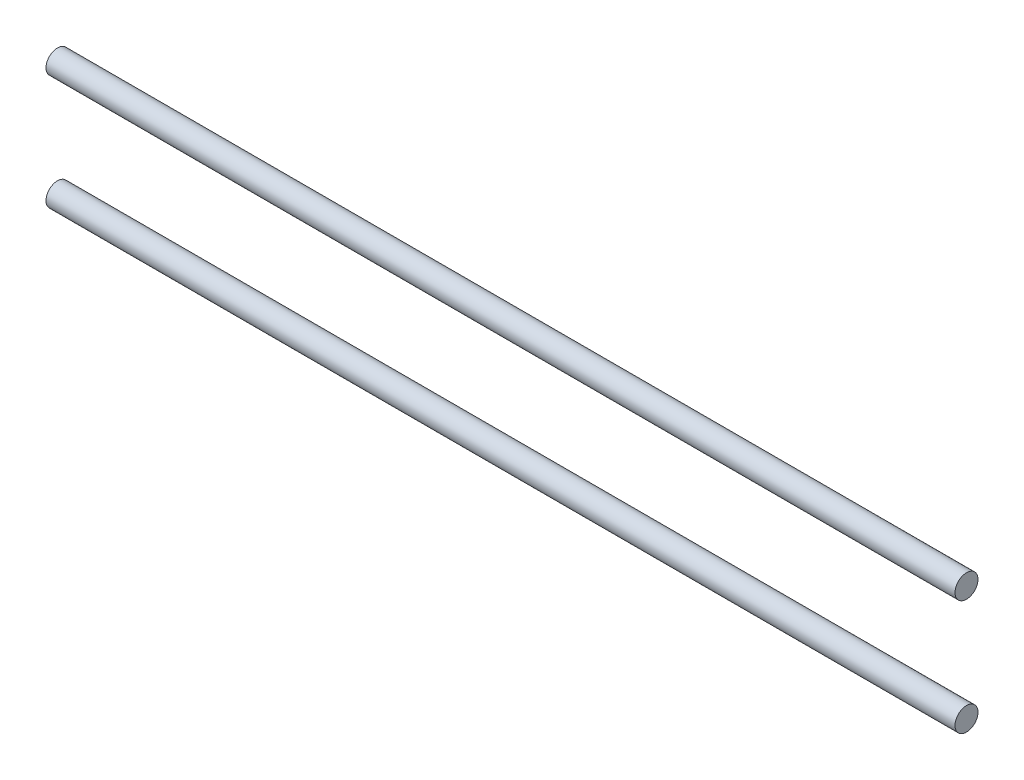
ISO-10303-21;
HEADER;
FILE_DESCRIPTION(('STEP AP214'),'2;1');
FILE_NAME('part.step','',(''),(''),'','','');
FILE_SCHEMA(('AUTOMOTIVE_DESIGN { 1 0 10303 214 1 1 1 1 }'));
ENDSEC;
DATA;
#1=APPLICATION_CONTEXT('core data for automotive mechanical design processes');
#2=APPLICATION_PROTOCOL_DEFINITION('international standard','automotive_design',2000,#1);
#3=PRODUCT_CONTEXT('',#1,'mechanical');
#4=PRODUCT('Part','Part','',(#3));
#5=PRODUCT_RELATED_PRODUCT_CATEGORY('part','',(#4));
#6=PRODUCT_DEFINITION_FORMATION('','',#4);
#7=PRODUCT_DEFINITION_CONTEXT('part definition',#1,'design');
#8=PRODUCT_DEFINITION('design','',#6,#7);
#9=PRODUCT_DEFINITION_SHAPE('','',#8);
#10=(LENGTH_UNIT() NAMED_UNIT(*) SI_UNIT(.MILLI.,.METRE.));
#11=(NAMED_UNIT(*) PLANE_ANGLE_UNIT() SI_UNIT($,.RADIAN.));
#12=(NAMED_UNIT(*) SI_UNIT($,.STERADIAN.) SOLID_ANGLE_UNIT());
#13=UNCERTAINTY_MEASURE_WITH_UNIT(LENGTH_MEASURE(1.E-05),#10,'distance_accuracy_value','');
#14=(GEOMETRIC_REPRESENTATION_CONTEXT(3) GLOBAL_UNCERTAINTY_ASSIGNED_CONTEXT((#13)) GLOBAL_UNIT_ASSIGNED_CONTEXT((#10,
#11,#12)) REPRESENTATION_CONTEXT('',''));
#15=CARTESIAN_POINT('',(0.,0.,0.));
#16=DIRECTION('',(0.,0.,1.));
#17=DIRECTION('',(1.,0.,0.));
#18=AXIS2_PLACEMENT_3D('',#15,#16,#17);
#19=CARTESIAN_POINT('',(251.680132868941,245.33609278304,373.677889561146));
#20=DIRECTION('',(1.,0.,0.));
#21=DIRECTION('',(0.,1.,0.));
#22=AXIS2_PLACEMENT_3D('',#19,#20,#21);
#23=PLANE('',#22);
#24=CARTESIAN_POINT('',(251.680132868941,245.33609278304,373.677889561146));
#25=DIRECTION('',(-1.,0.,0.));
#26=DIRECTION('',(0.,-1.,0.));
#27=AXIS2_PLACEMENT_3D('',#24,#25,#26);
#28=CIRCLE('',#27,4.00000000000006);
#29=CARTESIAN_POINT('',(251.680132868941,241.336092783039,373.677889561146));
#30=VERTEX_POINT('',#29);
#31=EDGE_CURVE('P0_E17',#30,#30,#28,.T.);
#32=ORIENTED_EDGE('',*,*,#31,.F.);
#33=EDGE_LOOP('',(#32));
#34=FACE_BOUND('',#33,.T.);
#35=ADVANCED_FACE('P0_F14',(#34),#23,.T.);
#36=CARTESIAN_POINT('',(-64.3198671310588,245.336092783039,373.677889561146));
#37=DIRECTION('',(1.,0.,0.));
#38=DIRECTION('',(0.,1.,0.));
#39=AXIS2_PLACEMENT_3D('',#36,#37,#38);
#40=PLANE('',#39);
#41=CARTESIAN_POINT('',(-64.3198671310589,245.336092783039,373.677889561146));
#42=DIRECTION('',(-1.,0.,0.));
#43=DIRECTION('',(0.,-1.,0.));
#44=AXIS2_PLACEMENT_3D('',#41,#42,#43);
#45=CIRCLE('',#44,4.00000000000006);
#46=CARTESIAN_POINT('',(-64.3198671310589,241.336092783039,373.677889561146));
#47=VERTEX_POINT('',#46);
#48=EDGE_CURVE('P0_E10',#47,#47,#45,.F.);
#49=ORIENTED_EDGE('',*,*,#48,.F.);
#50=EDGE_LOOP('',(#49));
#51=FACE_BOUND('',#50,.T.);
#52=ADVANCED_FACE('P0_F29',(#51),#40,.F.);
#53=CARTESIAN_POINT('',(251.680132868941,245.33609278304,373.677889561146));
#54=DIRECTION('',(-1.,0.,0.));
#55=DIRECTION('',(0.,-1.,0.));
#56=AXIS2_PLACEMENT_3D('',#53,#54,#55);
#57=CYLINDRICAL_SURFACE('',#56,4.00000000000006);
#58=ORIENTED_EDGE('',*,*,#48,.T.);
#59=EDGE_LOOP('',(#58));
#60=FACE_BOUND('',#59,.T.);
#61=ORIENTED_EDGE('',*,*,#31,.T.);
#62=EDGE_LOOP('',(#61));
#63=FACE_BOUND('',#62,.T.);
#64=ADVANCED_FACE('P0_F26',(#60,#63),#57,.T.);
#65=CLOSED_SHELL('',(#35,#52,#64));
#66=MANIFOLD_SOLID_BREP('P0_B1',#65);
#67=CARTESIAN_POINT('',(251.680132868941,285.336092783038,373.677889561147));
#68=DIRECTION('',(1.,0.,0.));
#69=DIRECTION('',(0.,1.,0.));
#70=AXIS2_PLACEMENT_3D('',#67,#68,#69);
#71=PLANE('',#70);
#72=CARTESIAN_POINT('',(251.680132868941,285.336092783038,373.677889561147));
#73=DIRECTION('',(-1.,0.,0.));
#74=DIRECTION('',(0.,-1.,0.));
#75=AXIS2_PLACEMENT_3D('',#72,#73,#74);
#76=CIRCLE('',#75,4.);
#77=CARTESIAN_POINT('',(251.680132868941,281.336092783038,373.677889561147));
#78=VERTEX_POINT('',#77);
#79=EDGE_CURVE('P1_E17',#78,#78,#76,.T.);
#80=ORIENTED_EDGE('',*,*,#79,.F.);
#81=EDGE_LOOP('',(#80));
#82=FACE_BOUND('',#81,.T.);
#83=ADVANCED_FACE('P1_F14',(#82),#71,.T.);
#84=CARTESIAN_POINT('',(-64.3198671310588,285.336092783038,373.677889561147));
#85=DIRECTION('',(1.,0.,0.));
#86=DIRECTION('',(0.,1.,0.));
#87=AXIS2_PLACEMENT_3D('',#84,#85,#86);
#88=PLANE('',#87);
#89=CARTESIAN_POINT('',(-64.3198671310589,285.336092783038,373.677889561147));
#90=DIRECTION('',(-1.,0.,0.));
#91=DIRECTION('',(0.,-1.,0.));
#92=AXIS2_PLACEMENT_3D('',#89,#90,#91);
#93=CIRCLE('',#92,4.);
#94=CARTESIAN_POINT('',(-64.3198671310589,281.336092783038,373.677889561147));
#95=VERTEX_POINT('',#94);
#96=EDGE_CURVE('P1_E10',#95,#95,#93,.F.);
#97=ORIENTED_EDGE('',*,*,#96,.F.);
#98=EDGE_LOOP('',(#97));
#99=FACE_BOUND('',#98,.T.);
#100=ADVANCED_FACE('P1_F29',(#99),#88,.F.);
#101=CARTESIAN_POINT('',(251.680132868941,285.336092783038,373.677889561147));
#102=DIRECTION('',(-1.,0.,0.));
#103=DIRECTION('',(0.,-1.,0.));
#104=AXIS2_PLACEMENT_3D('',#101,#102,#103);
#105=CYLINDRICAL_SURFACE('',#104,4.);
#106=ORIENTED_EDGE('',*,*,#96,.T.);
#107=EDGE_LOOP('',(#106));
#108=FACE_BOUND('',#107,.T.);
#109=ORIENTED_EDGE('',*,*,#79,.T.);
#110=EDGE_LOOP('',(#109));
#111=FACE_BOUND('',#110,.T.);
#112=ADVANCED_FACE('P1_F26',(#108,#111),#105,.T.);
#113=CLOSED_SHELL('',(#83,#100,#112));
#114=MANIFOLD_SOLID_BREP('P1_B1',#113);
#115=ADVANCED_BREP_SHAPE_REPRESENTATION('',(#18,#66,#114),#14);
#116=SHAPE_DEFINITION_REPRESENTATION(#9,#115);
ENDSEC;
END-ISO-10303-21;
